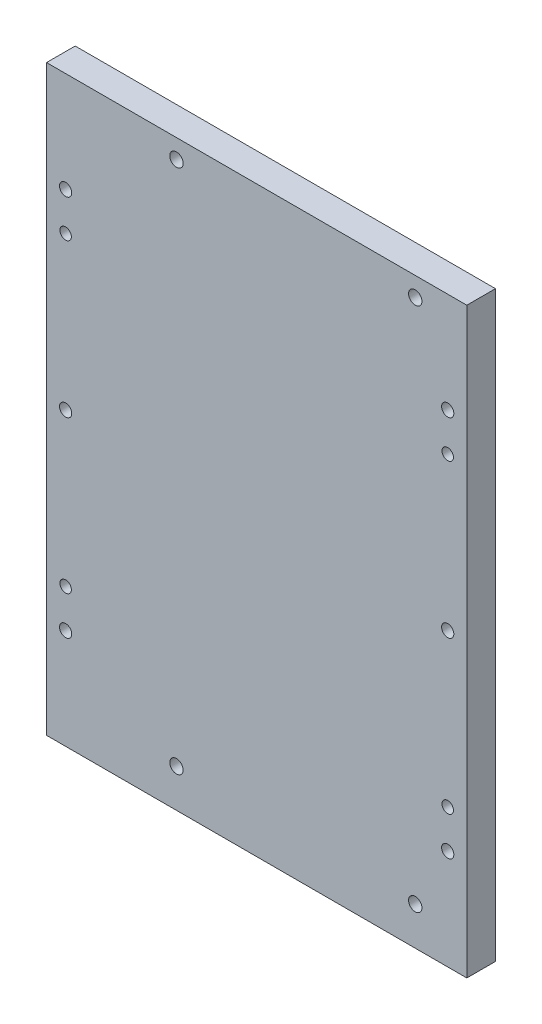
ISO-10303-21;
HEADER;
FILE_DESCRIPTION(('STEP AP214'),'2;1');
FILE_NAME('part.step','',(''),(''),'','','');
FILE_SCHEMA(('AUTOMOTIVE_DESIGN { 1 0 10303 214 1 1 1 1 }'));
ENDSEC;
DATA;
#1=APPLICATION_CONTEXT('core data for automotive mechanical design processes');
#2=APPLICATION_PROTOCOL_DEFINITION('international standard','automotive_design',2000,#1);
#3=PRODUCT_CONTEXT('',#1,'mechanical');
#4=PRODUCT('Part','Part','',(#3));
#5=PRODUCT_RELATED_PRODUCT_CATEGORY('part','',(#4));
#6=PRODUCT_DEFINITION_FORMATION('','',#4);
#7=PRODUCT_DEFINITION_CONTEXT('part definition',#1,'design');
#8=PRODUCT_DEFINITION('design','',#6,#7);
#9=PRODUCT_DEFINITION_SHAPE('','',#8);
#10=(LENGTH_UNIT() NAMED_UNIT(*) SI_UNIT(.MILLI.,.METRE.));
#11=(NAMED_UNIT(*) PLANE_ANGLE_UNIT() SI_UNIT($,.RADIAN.));
#12=(NAMED_UNIT(*) SI_UNIT($,.STERADIAN.) SOLID_ANGLE_UNIT());
#13=UNCERTAINTY_MEASURE_WITH_UNIT(LENGTH_MEASURE(1.E-05),#10,'distance_accuracy_value','');
#14=(GEOMETRIC_REPRESENTATION_CONTEXT(3) GLOBAL_UNCERTAINTY_ASSIGNED_CONTEXT((#13)) GLOBAL_UNIT_ASSIGNED_CONTEXT((#10,
#11,#12)) REPRESENTATION_CONTEXT('',''));
#15=CARTESIAN_POINT('',(0.,0.,0.));
#16=DIRECTION('',(0.,0.,1.));
#17=DIRECTION('',(1.,0.,0.));
#18=AXIS2_PLACEMENT_3D('',#15,#16,#17);
#19=CARTESIAN_POINT('',(100.,-100.,0.));
#20=DIRECTION('',(0.,0.,-1.));
#21=DIRECTION('',(-1.,0.,0.));
#22=AXIS2_PLACEMENT_3D('',#19,#20,#21);
#23=CYLINDRICAL_SURFACE('',#22,5.50000000000001);
#24=CARTESIAN_POINT('',(100.,-100.,0.));
#25=DIRECTION('',(0.,0.,-1.));
#26=DIRECTION('',(-1.,0.,0.));
#27=AXIS2_PLACEMENT_3D('',#24,#25,#26);
#28=CIRCLE('',#27,5.50000000000001);
#29=CARTESIAN_POINT('',(94.5,-100.,0.));
#30=VERTEX_POINT('',#29);
#31=EDGE_CURVE('E177',#30,#30,#28,.F.);
#32=ORIENTED_EDGE('',*,*,#31,.F.);
#33=EDGE_LOOP('',(#32));
#34=FACE_BOUND('',#33,.T.);
#35=CARTESIAN_POINT('',(100.,-100.,6.4));
#36=DIRECTION('',(0.,0.,-1.));
#37=DIRECTION('',(-1.,0.,0.));
#38=AXIS2_PLACEMENT_3D('',#35,#36,#37);
#39=CIRCLE('',#38,5.50000000000001);
#40=CARTESIAN_POINT('',(94.5,-100.,6.4));
#41=VERTEX_POINT('',#40);
#42=EDGE_CURVE('E19',#41,#41,#39,.F.);
#43=ORIENTED_EDGE('',*,*,#42,.T.);
#44=EDGE_LOOP('',(#43));
#45=FACE_BOUND('',#44,.T.);
#46=ADVANCED_FACE('F16',(#34,#45),#23,.F.);
#47=CARTESIAN_POINT('',(100.,0.,0.));
#48=DIRECTION('',(0.,0.,-1.));
#49=DIRECTION('',(-1.,0.,0.));
#50=AXIS2_PLACEMENT_3D('',#47,#48,#49);
#51=CYLINDRICAL_SURFACE('',#50,5.50000000000001);
#52=CARTESIAN_POINT('',(100.,0.,0.));
#53=DIRECTION('',(0.,0.,-1.));
#54=DIRECTION('',(-1.,0.,0.));
#55=AXIS2_PLACEMENT_3D('',#52,#53,#54);
#56=CIRCLE('',#55,5.50000000000001);
#57=CARTESIAN_POINT('',(94.5,0.,0.));
#58=VERTEX_POINT('',#57);
#59=EDGE_CURVE('E174',#58,#58,#56,.F.);
#60=ORIENTED_EDGE('',*,*,#59,.F.);
#61=EDGE_LOOP('',(#60));
#62=FACE_BOUND('',#61,.T.);
#63=CARTESIAN_POINT('',(100.,0.,6.4));
#64=DIRECTION('',(0.,0.,-1.));
#65=DIRECTION('',(-1.,0.,0.));
#66=AXIS2_PLACEMENT_3D('',#63,#64,#65);
#67=CIRCLE('',#66,5.50000000000001);
#68=CARTESIAN_POINT('',(94.5,0.,6.4));
#69=VERTEX_POINT('',#68);
#70=EDGE_CURVE('E191',#69,#69,#67,.F.);
#71=ORIENTED_EDGE('',*,*,#70,.T.);
#72=EDGE_LOOP('',(#71));
#73=FACE_BOUND('',#72,.T.);
#74=ADVANCED_FACE('F295',(#62,#73),#51,.F.);
#75=CARTESIAN_POINT('',(100.,100.,0.));
#76=DIRECTION('',(0.,0.,-1.));
#77=DIRECTION('',(-1.,0.,0.));
#78=AXIS2_PLACEMENT_3D('',#75,#76,#77);
#79=CYLINDRICAL_SURFACE('',#78,5.50000000000001);
#80=CARTESIAN_POINT('',(100.,100.,0.));
#81=DIRECTION('',(0.,0.,-1.));
#82=DIRECTION('',(-1.,0.,0.));
#83=AXIS2_PLACEMENT_3D('',#80,#81,#82);
#84=CIRCLE('',#83,5.50000000000001);
#85=CARTESIAN_POINT('',(94.5,100.,0.));
#86=VERTEX_POINT('',#85);
#87=EDGE_CURVE('E171',#86,#86,#84,.F.);
#88=ORIENTED_EDGE('',*,*,#87,.F.);
#89=EDGE_LOOP('',(#88));
#90=FACE_BOUND('',#89,.T.);
#91=CARTESIAN_POINT('',(100.,100.,6.4));
#92=DIRECTION('',(0.,0.,-1.));
#93=DIRECTION('',(-1.,0.,0.));
#94=AXIS2_PLACEMENT_3D('',#91,#92,#93);
#95=CIRCLE('',#94,5.50000000000001);
#96=CARTESIAN_POINT('',(94.5,100.,6.4));
#97=VERTEX_POINT('',#96);
#98=EDGE_CURVE('E189',#97,#97,#95,.F.);
#99=ORIENTED_EDGE('',*,*,#98,.T.);
#100=EDGE_LOOP('',(#99));
#101=FACE_BOUND('',#100,.T.);
#102=ADVANCED_FACE('F292',(#90,#101),#79,.F.);
#103=CARTESIAN_POINT('',(-100.,100.,0.));
#104=DIRECTION('',(0.,0.,-1.));
#105=DIRECTION('',(-1.,0.,0.));
#106=AXIS2_PLACEMENT_3D('',#103,#104,#105);
#107=CYLINDRICAL_SURFACE('',#106,5.50000000000001);
#108=CARTESIAN_POINT('',(-100.,100.,0.));
#109=DIRECTION('',(0.,0.,-1.));
#110=DIRECTION('',(-1.,0.,0.));
#111=AXIS2_PLACEMENT_3D('',#108,#109,#110);
#112=CIRCLE('',#111,5.50000000000001);
#113=CARTESIAN_POINT('',(-105.5,100.,0.));
#114=VERTEX_POINT('',#113);
#115=EDGE_CURVE('E168',#114,#114,#112,.F.);
#116=ORIENTED_EDGE('',*,*,#115,.F.);
#117=EDGE_LOOP('',(#116));
#118=FACE_BOUND('',#117,.T.);
#119=CARTESIAN_POINT('',(-100.,100.,6.4));
#120=DIRECTION('',(0.,0.,-1.));
#121=DIRECTION('',(-1.,0.,0.));
#122=AXIS2_PLACEMENT_3D('',#119,#120,#121);
#123=CIRCLE('',#122,5.50000000000001);
#124=CARTESIAN_POINT('',(-105.5,100.,6.4));
#125=VERTEX_POINT('',#124);
#126=EDGE_CURVE('E186',#125,#125,#123,.F.);
#127=ORIENTED_EDGE('',*,*,#126,.T.);
#128=EDGE_LOOP('',(#127));
#129=FACE_BOUND('',#128,.T.);
#130=ADVANCED_FACE('F288',(#118,#129),#107,.F.);
#131=CARTESIAN_POINT('',(-100.,0.,0.));
#132=DIRECTION('',(0.,0.,-1.));
#133=DIRECTION('',(-1.,0.,0.));
#134=AXIS2_PLACEMENT_3D('',#131,#132,#133);
#135=CYLINDRICAL_SURFACE('',#134,5.50000000000001);
#136=CARTESIAN_POINT('',(-100.,0.,0.));
#137=DIRECTION('',(0.,0.,-1.));
#138=DIRECTION('',(-1.,0.,0.));
#139=AXIS2_PLACEMENT_3D('',#136,#137,#138);
#140=CIRCLE('',#139,5.50000000000001);
#141=CARTESIAN_POINT('',(-105.5,0.,0.));
#142=VERTEX_POINT('',#141);
#143=EDGE_CURVE('E165',#142,#142,#140,.F.);
#144=ORIENTED_EDGE('',*,*,#143,.F.);
#145=EDGE_LOOP('',(#144));
#146=FACE_BOUND('',#145,.T.);
#147=CARTESIAN_POINT('',(-100.,0.,6.4));
#148=DIRECTION('',(0.,0.,-1.));
#149=DIRECTION('',(-1.,0.,0.));
#150=AXIS2_PLACEMENT_3D('',#147,#148,#149);
#151=CIRCLE('',#150,5.50000000000001);
#152=CARTESIAN_POINT('',(-105.5,0.,6.4));
#153=VERTEX_POINT('',#152);
#154=EDGE_CURVE('E183',#153,#153,#151,.F.);
#155=ORIENTED_EDGE('',*,*,#154,.T.);
#156=EDGE_LOOP('',(#155));
#157=FACE_BOUND('',#156,.T.);
#158=ADVANCED_FACE('F284',(#146,#157),#135,.F.);
#159=CARTESIAN_POINT('',(-100.,-100.,0.));
#160=DIRECTION('',(0.,0.,-1.));
#161=DIRECTION('',(-1.,0.,0.));
#162=AXIS2_PLACEMENT_3D('',#159,#160,#161);
#163=CYLINDRICAL_SURFACE('',#162,5.50000000000001);
#164=CARTESIAN_POINT('',(-100.,-100.,0.));
#165=DIRECTION('',(0.,0.,-1.));
#166=DIRECTION('',(-1.,0.,0.));
#167=AXIS2_PLACEMENT_3D('',#164,#165,#166);
#168=CIRCLE('',#167,5.50000000000001);
#169=CARTESIAN_POINT('',(-105.5,-100.,0.));
#170=VERTEX_POINT('',#169);
#171=EDGE_CURVE('E162',#170,#170,#168,.F.);
#172=ORIENTED_EDGE('',*,*,#171,.F.);
#173=EDGE_LOOP('',(#172));
#174=FACE_BOUND('',#173,.T.);
#175=CARTESIAN_POINT('',(-100.,-100.,6.4));
#176=DIRECTION('',(0.,0.,-1.));
#177=DIRECTION('',(-1.,0.,0.));
#178=AXIS2_PLACEMENT_3D('',#175,#176,#177);
#179=CIRCLE('',#178,5.50000000000001);
#180=CARTESIAN_POINT('',(-105.5,-100.,6.4));
#181=VERTEX_POINT('',#180);
#182=EDGE_CURVE('E180',#181,#181,#179,.F.);
#183=ORIENTED_EDGE('',*,*,#182,.T.);
#184=EDGE_LOOP('',(#183));
#185=FACE_BOUND('',#184,.T.);
#186=ADVANCED_FACE('F203',(#174,#185),#163,.F.);
#187=CARTESIAN_POINT('',(103.2,-100.,6.4));
#188=DIRECTION('',(0.,0.,1.));
#189=DIRECTION('',(1.,0.,0.));
#190=AXIS2_PLACEMENT_3D('',#187,#188,#189);
#191=PLANE('',#190);
#192=ORIENTED_EDGE('',*,*,#42,.F.);
#193=EDGE_LOOP('',(#192));
#194=FACE_BOUND('',#193,.T.);
#195=CARTESIAN_POINT('',(100.,-100.,6.4));
#196=DIRECTION('',(0.,0.,-1.));
#197=DIRECTION('',(-1.,0.,0.));
#198=AXIS2_PLACEMENT_3D('',#195,#196,#197);
#199=CIRCLE('',#198,3.19999999999999);
#200=CARTESIAN_POINT('',(96.8,-100.,6.4));
#201=VERTEX_POINT('',#200);
#202=EDGE_CURVE('E145',#201,#201,#199,.F.);
#203=ORIENTED_EDGE('',*,*,#202,.T.);
#204=EDGE_LOOP('',(#203));
#205=FACE_BOUND('',#204,.T.);
#206=ADVANCED_FACE('F199',(#194,#205),#191,.F.);
#207=CARTESIAN_POINT('',(103.2,0.,6.4));
#208=DIRECTION('',(0.,0.,1.));
#209=DIRECTION('',(1.,0.,0.));
#210=AXIS2_PLACEMENT_3D('',#207,#208,#209);
#211=PLANE('',#210);
#212=ORIENTED_EDGE('',*,*,#70,.F.);
#213=EDGE_LOOP('',(#212));
#214=FACE_BOUND('',#213,.T.);
#215=CARTESIAN_POINT('',(100.,0.,6.4));
#216=DIRECTION('',(0.,0.,-1.));
#217=DIRECTION('',(-1.,0.,0.));
#218=AXIS2_PLACEMENT_3D('',#215,#216,#217);
#219=CIRCLE('',#218,3.19999999999999);
#220=CARTESIAN_POINT('',(96.8,0.,6.4));
#221=VERTEX_POINT('',#220);
#222=EDGE_CURVE('E142',#221,#221,#219,.F.);
#223=ORIENTED_EDGE('',*,*,#222,.T.);
#224=EDGE_LOOP('',(#223));
#225=FACE_BOUND('',#224,.T.);
#226=ADVANCED_FACE('F202',(#214,#225),#211,.F.);
#227=CARTESIAN_POINT('',(103.2,100.,6.4));
#228=DIRECTION('',(0.,0.,1.));
#229=DIRECTION('',(1.,0.,0.));
#230=AXIS2_PLACEMENT_3D('',#227,#228,#229);
#231=PLANE('',#230);
#232=ORIENTED_EDGE('',*,*,#98,.F.);
#233=EDGE_LOOP('',(#232));
#234=FACE_BOUND('',#233,.T.);
#235=CARTESIAN_POINT('',(100.,100.,6.4));
#236=DIRECTION('',(0.,0.,-1.));
#237=DIRECTION('',(-1.,0.,0.));
#238=AXIS2_PLACEMENT_3D('',#235,#236,#237);
#239=CIRCLE('',#238,3.19999999999999);
#240=CARTESIAN_POINT('',(96.8,100.,6.4));
#241=VERTEX_POINT('',#240);
#242=EDGE_CURVE('E139',#241,#241,#239,.F.);
#243=ORIENTED_EDGE('',*,*,#242,.T.);
#244=EDGE_LOOP('',(#243));
#245=FACE_BOUND('',#244,.T.);
#246=ADVANCED_FACE('F265',(#234,#245),#231,.F.);
#247=CARTESIAN_POINT('',(-96.8,100.,6.4));
#248=DIRECTION('',(0.,0.,1.));
#249=DIRECTION('',(1.,0.,0.));
#250=AXIS2_PLACEMENT_3D('',#247,#248,#249);
#251=PLANE('',#250);
#252=ORIENTED_EDGE('',*,*,#126,.F.);
#253=EDGE_LOOP('',(#252));
#254=FACE_BOUND('',#253,.T.);
#255=CARTESIAN_POINT('',(-100.,100.,6.4));
#256=DIRECTION('',(0.,0.,-1.));
#257=DIRECTION('',(-1.,0.,0.));
#258=AXIS2_PLACEMENT_3D('',#255,#256,#257);
#259=CIRCLE('',#258,3.19999999999999);
#260=CARTESIAN_POINT('',(-103.2,100.,6.4));
#261=VERTEX_POINT('',#260);
#262=EDGE_CURVE('E136',#261,#261,#259,.F.);
#263=ORIENTED_EDGE('',*,*,#262,.T.);
#264=EDGE_LOOP('',(#263));
#265=FACE_BOUND('',#264,.T.);
#266=ADVANCED_FACE('F267',(#254,#265),#251,.F.);
#267=CARTESIAN_POINT('',(-96.8,0.,6.4));
#268=DIRECTION('',(0.,0.,1.));
#269=DIRECTION('',(1.,0.,0.));
#270=AXIS2_PLACEMENT_3D('',#267,#268,#269);
#271=PLANE('',#270);
#272=ORIENTED_EDGE('',*,*,#154,.F.);
#273=EDGE_LOOP('',(#272));
#274=FACE_BOUND('',#273,.T.);
#275=CARTESIAN_POINT('',(-100.,0.,6.4));
#276=DIRECTION('',(0.,0.,-1.));
#277=DIRECTION('',(-1.,0.,0.));
#278=AXIS2_PLACEMENT_3D('',#275,#276,#277);
#279=CIRCLE('',#278,3.19999999999999);
#280=CARTESIAN_POINT('',(-103.2,0.,6.4));
#281=VERTEX_POINT('',#280);
#282=EDGE_CURVE('E133',#281,#281,#279,.F.);
#283=ORIENTED_EDGE('',*,*,#282,.T.);
#284=EDGE_LOOP('',(#283));
#285=FACE_BOUND('',#284,.T.);
#286=ADVANCED_FACE('F274',(#274,#285),#271,.F.);
#287=CARTESIAN_POINT('',(-96.8,-100.,6.4));
#288=DIRECTION('',(0.,0.,1.));
#289=DIRECTION('',(1.,0.,0.));
#290=AXIS2_PLACEMENT_3D('',#287,#288,#289);
#291=PLANE('',#290);
#292=ORIENTED_EDGE('',*,*,#182,.F.);
#293=EDGE_LOOP('',(#292));
#294=FACE_BOUND('',#293,.T.);
#295=CARTESIAN_POINT('',(-100.,-100.,6.4));
#296=DIRECTION('',(0.,0.,-1.));
#297=DIRECTION('',(-1.,0.,0.));
#298=AXIS2_PLACEMENT_3D('',#295,#296,#297);
#299=CIRCLE('',#298,3.19999999999999);
#300=CARTESIAN_POINT('',(-103.2,-100.,6.4));
#301=VERTEX_POINT('',#300);
#302=EDGE_CURVE('E130',#301,#301,#299,.F.);
#303=ORIENTED_EDGE('',*,*,#302,.T.);
#304=EDGE_LOOP('',(#303));
#305=FACE_BOUND('',#304,.T.);
#306=ADVANCED_FACE('F308',(#294,#305),#291,.F.);
#307=CARTESIAN_POINT('',(-110.,-152.5,0.));
#308=DIRECTION('',(0.,0.,-1.));
#309=DIRECTION('',(-1.,0.,0.));
#310=AXIS2_PLACEMENT_3D('',#307,#308,#309);
#311=PLANE('',#310);
#312=CARTESIAN_POINT('',(83.0000000000001,142.5,0.));
#313=DIRECTION('',(0.,0.,1.));
#314=DIRECTION('',(1.,0.,0.));
#315=AXIS2_PLACEMENT_3D('',#312,#313,#314);
#316=CIRCLE('',#315,3.5);
#317=CARTESIAN_POINT('',(86.5000000000001,142.5,0.));
#318=VERTEX_POINT('',#317);
#319=EDGE_CURVE('E124',#318,#318,#316,.T.);
#320=ORIENTED_EDGE('',*,*,#319,.T.);
#321=EDGE_LOOP('',(#320));
#322=FACE_BOUND('',#321,.T.);
#323=CARTESIAN_POINT('',(-42.0000000000002,-132.5,0.));
#324=DIRECTION('',(0.,0.,1.));
#325=DIRECTION('',(1.,0.,0.));
#326=AXIS2_PLACEMENT_3D('',#323,#324,#325);
#327=CIRCLE('',#326,3.5);
#328=CARTESIAN_POINT('',(-38.5000000000002,-132.5,0.));
#329=VERTEX_POINT('',#328);
#330=EDGE_CURVE('E127',#329,#329,#327,.T.);
#331=ORIENTED_EDGE('',*,*,#330,.T.);
#332=EDGE_LOOP('',(#331));
#333=FACE_BOUND('',#332,.T.);
#334=ORIENTED_EDGE('',*,*,#171,.T.);
#335=EDGE_LOOP('',(#334));
#336=FACE_BOUND('',#335,.T.);
#337=ORIENTED_EDGE('',*,*,#143,.T.);
#338=EDGE_LOOP('',(#337));
#339=FACE_BOUND('',#338,.T.);
#340=ORIENTED_EDGE('',*,*,#115,.T.);
#341=EDGE_LOOP('',(#340));
#342=FACE_BOUND('',#341,.T.);
#343=ORIENTED_EDGE('',*,*,#87,.T.);
#344=EDGE_LOOP('',(#343));
#345=FACE_BOUND('',#344,.T.);
#346=ORIENTED_EDGE('',*,*,#59,.T.);
#347=EDGE_LOOP('',(#346));
#348=FACE_BOUND('',#347,.T.);
#349=ORIENTED_EDGE('',*,*,#31,.T.);
#350=EDGE_LOOP('',(#349));
#351=FACE_BOUND('',#350,.T.);
#352=CARTESIAN_POINT('',(-100.,-80.,0.));
#353=DIRECTION('',(0.,0.,1.));
#354=DIRECTION('',(1.,0.,0.));
#355=AXIS2_PLACEMENT_3D('',#352,#353,#354);
#356=CIRCLE('',#355,2.99499999999998);
#357=CARTESIAN_POINT('',(-97.005,-80.,0.));
#358=VERTEX_POINT('',#357);
#359=EDGE_CURVE('E148',#358,#358,#356,.T.);
#360=ORIENTED_EDGE('',*,*,#359,.T.);
#361=EDGE_LOOP('',(#360));
#362=FACE_BOUND('',#361,.T.);
#363=CARTESIAN_POINT('',(-100.,80.,0.));
#364=DIRECTION('',(0.,0.,1.));
#365=DIRECTION('',(1.,0.,0.));
#366=AXIS2_PLACEMENT_3D('',#363,#364,#365);
#367=CIRCLE('',#366,2.995);
#368=CARTESIAN_POINT('',(-97.005,80.,0.));
#369=VERTEX_POINT('',#368);
#370=EDGE_CURVE('E151',#369,#369,#367,.T.);
#371=ORIENTED_EDGE('',*,*,#370,.T.);
#372=EDGE_LOOP('',(#371));
#373=FACE_BOUND('',#372,.T.);
#374=CARTESIAN_POINT('',(100.,80.,0.));
#375=DIRECTION('',(0.,0.,1.));
#376=DIRECTION('',(1.,0.,0.));
#377=AXIS2_PLACEMENT_3D('',#374,#375,#376);
#378=CIRCLE('',#377,2.995);
#379=CARTESIAN_POINT('',(102.995,80.,0.));
#380=VERTEX_POINT('',#379);
#381=EDGE_CURVE('E154',#380,#380,#378,.T.);
#382=ORIENTED_EDGE('',*,*,#381,.T.);
#383=EDGE_LOOP('',(#382));
#384=FACE_BOUND('',#383,.T.);
#385=CARTESIAN_POINT('',(100.,-80.,0.));
#386=DIRECTION('',(0.,0.,1.));
#387=DIRECTION('',(1.,0.,0.));
#388=AXIS2_PLACEMENT_3D('',#385,#386,#387);
#389=CIRCLE('',#388,2.99499999999998);
#390=CARTESIAN_POINT('',(102.995,-80.,0.));
#391=VERTEX_POINT('',#390);
#392=EDGE_CURVE('E157',#391,#391,#389,.T.);
#393=ORIENTED_EDGE('',*,*,#392,.T.);
#394=EDGE_LOOP('',(#393));
#395=FACE_BOUND('',#394,.T.);
#396=DIRECTION('',(1.,0.,0.));
#397=VECTOR('',#396,1.);
#398=CARTESIAN_POINT('',(-110.,152.5,0.));
#399=LINE('',#398,#397);
#400=CARTESIAN_POINT('',(-110.,152.5,0.));
#401=VERTEX_POINT('',#400);
#402=CARTESIAN_POINT('',(110.,152.5,0.));
#403=VERTEX_POINT('',#402);
#404=EDGE_CURVE('E55',#401,#403,#399,.T.);
#405=ORIENTED_EDGE('',*,*,#404,.T.);
#406=DIRECTION('',(0.,1.,0.));
#407=VECTOR('',#406,1.);
#408=CARTESIAN_POINT('',(110.,152.5,0.));
#409=LINE('',#408,#407);
#410=CARTESIAN_POINT('',(110.,-152.5,0.));
#411=VERTEX_POINT('',#410);
#412=EDGE_CURVE('E503',#403,#411,#409,.F.);
#413=ORIENTED_EDGE('',*,*,#412,.T.);
#414=DIRECTION('',(-1.,0.,0.));
#415=VECTOR('',#414,1.);
#416=CARTESIAN_POINT('',(110.,-152.5,0.));
#417=LINE('',#416,#415);
#418=CARTESIAN_POINT('',(-110.,-152.5,0.));
#419=VERTEX_POINT('',#418);
#420=EDGE_CURVE('E61',#411,#419,#417,.T.);
#421=ORIENTED_EDGE('',*,*,#420,.T.);
#422=DIRECTION('',(0.,1.,0.));
#423=VECTOR('',#422,1.);
#424=CARTESIAN_POINT('',(-110.,-152.5,0.));
#425=LINE('',#424,#423);
#426=EDGE_CURVE('E58',#419,#401,#425,.T.);
#427=ORIENTED_EDGE('',*,*,#426,.T.);
#428=EDGE_LOOP('',(#405,#413,#421,#427));
#429=FACE_BOUND('',#428,.T.);
#430=CARTESIAN_POINT('',(83.0000000000001,-132.5,0.));
#431=DIRECTION('',(0.,0.,1.));
#432=DIRECTION('',(1.,0.,0.));
#433=AXIS2_PLACEMENT_3D('',#430,#431,#432);
#434=CIRCLE('',#433,3.5);
#435=CARTESIAN_POINT('',(86.5000000000001,-132.5,0.));
#436=VERTEX_POINT('',#435);
#437=EDGE_CURVE('E121',#436,#436,#434,.T.);
#438=ORIENTED_EDGE('',*,*,#437,.T.);
#439=EDGE_LOOP('',(#438));
#440=FACE_BOUND('',#439,.T.);
#441=CARTESIAN_POINT('',(-42.0000000000002,142.5,0.));
#442=DIRECTION('',(0.,0.,1.));
#443=DIRECTION('',(1.,0.,0.));
#444=AXIS2_PLACEMENT_3D('',#441,#442,#443);
#445=CIRCLE('',#444,3.5);
#446=CARTESIAN_POINT('',(-38.5000000000002,142.5,0.));
#447=VERTEX_POINT('',#446);
#448=EDGE_CURVE('E67',#447,#447,#445,.T.);
#449=ORIENTED_EDGE('',*,*,#448,.T.);
#450=EDGE_LOOP('',(#449));
#451=FACE_BOUND('',#450,.T.);
#452=ADVANCED_FACE('F59',(#322,#333,#336,#339,#342,#345,#348,#351,#362,#373,#384,#395,#429,#440,
#451),#311,.T.);
#453=CARTESIAN_POINT('',(-42.0000000000002,142.5,15.));
#454=DIRECTION('',(0.,0.,1.));
#455=DIRECTION('',(1.,0.,0.));
#456=AXIS2_PLACEMENT_3D('',#453,#454,#455);
#457=CYLINDRICAL_SURFACE('',#456,3.5);
#458=ORIENTED_EDGE('',*,*,#448,.F.);
#459=EDGE_LOOP('',(#458));
#460=FACE_BOUND('',#459,.T.);
#461=CARTESIAN_POINT('',(-42.0000000000002,142.5,15.));
#462=DIRECTION('',(0.,0.,1.));
#463=DIRECTION('',(1.,0.,0.));
#464=AXIS2_PLACEMENT_3D('',#461,#462,#463);
#465=CIRCLE('',#464,3.5);
#466=CARTESIAN_POINT('',(-38.5000000000002,142.5,15.));
#467=VERTEX_POINT('',#466);
#468=EDGE_CURVE('E118',#467,#467,#465,.T.);
#469=ORIENTED_EDGE('',*,*,#468,.T.);
#470=EDGE_LOOP('',(#469));
#471=FACE_BOUND('',#470,.T.);
#472=ADVANCED_FACE('F307',(#460,#471),#457,.F.);
#473=CARTESIAN_POINT('',(-110.,-152.5,15.));
#474=DIRECTION('',(1.,0.,0.));
#475=DIRECTION('',(0.,0.,-1.));
#476=AXIS2_PLACEMENT_3D('',#473,#474,#475);
#477=PLANE('',#476);
#478=DIRECTION('',(0.,0.,1.));
#479=VECTOR('',#478,1.);
#480=CARTESIAN_POINT('',(-110.,-152.5,15.));
#481=LINE('',#480,#479);
#482=CARTESIAN_POINT('',(-110.,-152.5,15.));
#483=VERTEX_POINT('',#482);
#484=EDGE_CURVE('E504',#419,#483,#481,.T.);
#485=ORIENTED_EDGE('',*,*,#484,.T.);
#486=DIRECTION('',(0.,1.,0.));
#487=VECTOR('',#486,1.);
#488=CARTESIAN_POINT('',(-110.,-152.5,15.));
#489=LINE('',#488,#487);
#490=CARTESIAN_POINT('',(-110.,152.5,15.));
#491=VERTEX_POINT('',#490);
#492=EDGE_CURVE('E78',#483,#491,#489,.T.);
#493=ORIENTED_EDGE('',*,*,#492,.T.);
#494=DIRECTION('',(0.,0.,1.));
#495=VECTOR('',#494,1.);
#496=CARTESIAN_POINT('',(-110.,152.5,15.));
#497=LINE('',#496,#495);
#498=EDGE_CURVE('E66',#491,#401,#497,.F.);
#499=ORIENTED_EDGE('',*,*,#498,.T.);
#500=ORIENTED_EDGE('',*,*,#426,.F.);
#501=EDGE_LOOP('',(#485,#493,#499,#500));
#502=FACE_BOUND('',#501,.T.);
#503=ADVANCED_FACE('F77',(#502),#477,.F.);
#504=CARTESIAN_POINT('',(-110.,152.5,15.));
#505=DIRECTION('',(0.,-1.,0.));
#506=DIRECTION('',(1.,0.,0.));
#507=AXIS2_PLACEMENT_3D('',#504,#505,#506);
#508=PLANE('',#507);
#509=ORIENTED_EDGE('',*,*,#498,.F.);
#510=DIRECTION('',(-1.,0.,0.));
#511=VECTOR('',#510,1.);
#512=CARTESIAN_POINT('',(-110.,152.5,15.));
#513=LINE('',#512,#511);
#514=CARTESIAN_POINT('',(110.,152.5,15.));
#515=VERTEX_POINT('',#514);
#516=EDGE_CURVE('E511',#491,#515,#513,.F.);
#517=ORIENTED_EDGE('',*,*,#516,.T.);
#518=DIRECTION('',(0.,0.,1.));
#519=VECTOR('',#518,1.);
#520=CARTESIAN_POINT('',(110.,152.5,15.));
#521=LINE('',#520,#519);
#522=EDGE_CURVE('E74',#515,#403,#521,.F.);
#523=ORIENTED_EDGE('',*,*,#522,.T.);
#524=ORIENTED_EDGE('',*,*,#404,.F.);
#525=EDGE_LOOP('',(#509,#517,#523,#524));
#526=FACE_BOUND('',#525,.T.);
#527=ADVANCED_FACE('F71',(#526),#508,.F.);
#528=CARTESIAN_POINT('',(110.,152.5,15.));
#529=DIRECTION('',(-1.,0.,0.));
#530=DIRECTION('',(0.,0.,1.));
#531=AXIS2_PLACEMENT_3D('',#528,#529,#530);
#532=PLANE('',#531);
#533=ORIENTED_EDGE('',*,*,#522,.F.);
#534=DIRECTION('',(0.,1.,0.));
#535=VECTOR('',#534,1.);
#536=CARTESIAN_POINT('',(110.,-152.5,15.));
#537=LINE('',#536,#535);
#538=CARTESIAN_POINT('',(110.,-152.5,15.));
#539=VERTEX_POINT('',#538);
#540=EDGE_CURVE('E333',#515,#539,#537,.F.);
#541=ORIENTED_EDGE('',*,*,#540,.T.);
#542=DIRECTION('',(0.,0.,1.));
#543=VECTOR('',#542,1.);
#544=CARTESIAN_POINT('',(110.,-152.5,15.));
#545=LINE('',#544,#543);
#546=EDGE_CURVE('E34',#539,#411,#545,.F.);
#547=ORIENTED_EDGE('',*,*,#546,.T.);
#548=ORIENTED_EDGE('',*,*,#412,.F.);
#549=EDGE_LOOP('',(#533,#541,#547,#548));
#550=FACE_BOUND('',#549,.T.);
#551=ADVANCED_FACE('F391',(#550),#532,.F.);
#552=CARTESIAN_POINT('',(110.,-152.5,15.));
#553=DIRECTION('',(0.,1.,0.));
#554=DIRECTION('',(-1.,0.,0.));
#555=AXIS2_PLACEMENT_3D('',#552,#553,#554);
#556=PLANE('',#555);
#557=ORIENTED_EDGE('',*,*,#546,.F.);
#558=DIRECTION('',(-1.,0.,0.));
#559=VECTOR('',#558,1.);
#560=CARTESIAN_POINT('',(-110.,-152.5,15.));
#561=LINE('',#560,#559);
#562=EDGE_CURVE('E117',#539,#483,#561,.T.);
#563=ORIENTED_EDGE('',*,*,#562,.T.);
#564=ORIENTED_EDGE('',*,*,#484,.F.);
#565=ORIENTED_EDGE('',*,*,#420,.F.);
#566=EDGE_LOOP('',(#557,#563,#564,#565));
#567=FACE_BOUND('',#566,.T.);
#568=ADVANCED_FACE('F325',(#567),#556,.F.);
#569=CARTESIAN_POINT('',(100.,-80.,15.));
#570=DIRECTION('',(0.,0.,1.));
#571=DIRECTION('',(1.,0.,0.));
#572=AXIS2_PLACEMENT_3D('',#569,#570,#571);
#573=CYLINDRICAL_SURFACE('',#572,2.99499999999998);
#574=ORIENTED_EDGE('',*,*,#392,.F.);
#575=EDGE_LOOP('',(#574));
#576=FACE_BOUND('',#575,.T.);
#577=CARTESIAN_POINT('',(100.,-80.,15.));
#578=DIRECTION('',(0.,0.,1.));
#579=DIRECTION('',(1.,0.,0.));
#580=AXIS2_PLACEMENT_3D('',#577,#578,#579);
#581=CIRCLE('',#580,2.99499999999998);
#582=CARTESIAN_POINT('',(102.995,-80.,15.));
#583=VERTEX_POINT('',#582);
#584=EDGE_CURVE('E114',#583,#583,#581,.T.);
#585=ORIENTED_EDGE('',*,*,#584,.T.);
#586=EDGE_LOOP('',(#585));
#587=FACE_BOUND('',#586,.T.);
#588=ADVANCED_FACE('F321',(#576,#587),#573,.F.);
#589=CARTESIAN_POINT('',(100.,80.,15.));
#590=DIRECTION('',(0.,0.,1.));
#591=DIRECTION('',(1.,0.,0.));
#592=AXIS2_PLACEMENT_3D('',#589,#590,#591);
#593=CYLINDRICAL_SURFACE('',#592,2.995);
#594=ORIENTED_EDGE('',*,*,#381,.F.);
#595=EDGE_LOOP('',(#594));
#596=FACE_BOUND('',#595,.T.);
#597=CARTESIAN_POINT('',(100.,80.,15.));
#598=DIRECTION('',(0.,0.,1.));
#599=DIRECTION('',(1.,0.,0.));
#600=AXIS2_PLACEMENT_3D('',#597,#598,#599);
#601=CIRCLE('',#600,2.995);
#602=CARTESIAN_POINT('',(102.995,80.,15.));
#603=VERTEX_POINT('',#602);
#604=EDGE_CURVE('E111',#603,#603,#601,.T.);
#605=ORIENTED_EDGE('',*,*,#604,.T.);
#606=EDGE_LOOP('',(#605));
#607=FACE_BOUND('',#606,.T.);
#608=ADVANCED_FACE('F324',(#596,#607),#593,.F.);
#609=CARTESIAN_POINT('',(-100.,80.,15.));
#610=DIRECTION('',(0.,0.,1.));
#611=DIRECTION('',(1.,0.,0.));
#612=AXIS2_PLACEMENT_3D('',#609,#610,#611);
#613=CYLINDRICAL_SURFACE('',#612,2.995);
#614=ORIENTED_EDGE('',*,*,#370,.F.);
#615=EDGE_LOOP('',(#614));
#616=FACE_BOUND('',#615,.T.);
#617=CARTESIAN_POINT('',(-100.,80.,15.));
#618=DIRECTION('',(0.,0.,1.));
#619=DIRECTION('',(1.,0.,0.));
#620=AXIS2_PLACEMENT_3D('',#617,#618,#619);
#621=CIRCLE('',#620,2.995);
#622=CARTESIAN_POINT('',(-97.005,80.,15.));
#623=VERTEX_POINT('',#622);
#624=EDGE_CURVE('E108',#623,#623,#621,.T.);
#625=ORIENTED_EDGE('',*,*,#624,.T.);
#626=EDGE_LOOP('',(#625));
#627=FACE_BOUND('',#626,.T.);
#628=ADVANCED_FACE('F221',(#616,#627),#613,.F.);
#629=CARTESIAN_POINT('',(-100.,-80.,15.));
#630=DIRECTION('',(0.,0.,1.));
#631=DIRECTION('',(1.,0.,0.));
#632=AXIS2_PLACEMENT_3D('',#629,#630,#631);
#633=CYLINDRICAL_SURFACE('',#632,2.99499999999998);
#634=ORIENTED_EDGE('',*,*,#359,.F.);
#635=EDGE_LOOP('',(#634));
#636=FACE_BOUND('',#635,.T.);
#637=CARTESIAN_POINT('',(-100.,-80.,15.));
#638=DIRECTION('',(0.,0.,1.));
#639=DIRECTION('',(1.,0.,0.));
#640=AXIS2_PLACEMENT_3D('',#637,#638,#639);
#641=CIRCLE('',#640,2.99499999999998);
#642=CARTESIAN_POINT('',(-97.005,-80.,15.));
#643=VERTEX_POINT('',#642);
#644=EDGE_CURVE('E105',#643,#643,#641,.T.);
#645=ORIENTED_EDGE('',*,*,#644,.T.);
#646=EDGE_LOOP('',(#645));
#647=FACE_BOUND('',#646,.T.);
#648=ADVANCED_FACE('F210',(#636,#647),#633,.F.);
#649=CARTESIAN_POINT('',(100.,-100.,0.));
#650=DIRECTION('',(0.,0.,-1.));
#651=DIRECTION('',(-1.,0.,0.));
#652=AXIS2_PLACEMENT_3D('',#649,#650,#651);
#653=CYLINDRICAL_SURFACE('',#652,3.19999999999999);
#654=CARTESIAN_POINT('',(100.,-100.,15.));
#655=DIRECTION('',(0.,0.,-1.));
#656=DIRECTION('',(-1.,0.,0.));
#657=AXIS2_PLACEMENT_3D('',#654,#655,#656);
#658=CIRCLE('',#657,3.19999999999999);
#659=CARTESIAN_POINT('',(96.8,-100.,15.));
#660=VERTEX_POINT('',#659);
#661=EDGE_CURVE('E102',#660,#660,#658,.F.);
#662=ORIENTED_EDGE('',*,*,#661,.T.);
#663=EDGE_LOOP('',(#662));
#664=FACE_BOUND('',#663,.T.);
#665=ORIENTED_EDGE('',*,*,#202,.F.);
#666=EDGE_LOOP('',(#665));
#667=FACE_BOUND('',#666,.T.);
#668=ADVANCED_FACE('F207',(#664,#667),#653,.F.);
#669=CARTESIAN_POINT('',(100.,0.,0.));
#670=DIRECTION('',(0.,0.,-1.));
#671=DIRECTION('',(-1.,0.,0.));
#672=AXIS2_PLACEMENT_3D('',#669,#670,#671);
#673=CYLINDRICAL_SURFACE('',#672,3.19999999999999);
#674=CARTESIAN_POINT('',(100.,0.,15.));
#675=DIRECTION('',(0.,0.,-1.));
#676=DIRECTION('',(-1.,0.,0.));
#677=AXIS2_PLACEMENT_3D('',#674,#675,#676);
#678=CIRCLE('',#677,3.19999999999999);
#679=CARTESIAN_POINT('',(96.8,0.,15.));
#680=VERTEX_POINT('',#679);
#681=EDGE_CURVE('E99',#680,#680,#678,.F.);
#682=ORIENTED_EDGE('',*,*,#681,.T.);
#683=EDGE_LOOP('',(#682));
#684=FACE_BOUND('',#683,.T.);
#685=ORIENTED_EDGE('',*,*,#222,.F.);
#686=EDGE_LOOP('',(#685));
#687=FACE_BOUND('',#686,.T.);
#688=ADVANCED_FACE('F209',(#684,#687),#673,.F.);
#689=CARTESIAN_POINT('',(100.,100.,0.));
#690=DIRECTION('',(0.,0.,-1.));
#691=DIRECTION('',(-1.,0.,0.));
#692=AXIS2_PLACEMENT_3D('',#689,#690,#691);
#693=CYLINDRICAL_SURFACE('',#692,3.19999999999999);
#694=CARTESIAN_POINT('',(100.,100.,15.));
#695=DIRECTION('',(0.,0.,-1.));
#696=DIRECTION('',(-1.,0.,0.));
#697=AXIS2_PLACEMENT_3D('',#694,#695,#696);
#698=CIRCLE('',#697,3.19999999999999);
#699=CARTESIAN_POINT('',(96.8,100.,15.));
#700=VERTEX_POINT('',#699);
#701=EDGE_CURVE('E96',#700,#700,#698,.F.);
#702=ORIENTED_EDGE('',*,*,#701,.T.);
#703=EDGE_LOOP('',(#702));
#704=FACE_BOUND('',#703,.T.);
#705=ORIENTED_EDGE('',*,*,#242,.F.);
#706=EDGE_LOOP('',(#705));
#707=FACE_BOUND('',#706,.T.);
#708=ADVANCED_FACE('F218',(#704,#707),#693,.F.);
#709=CARTESIAN_POINT('',(-100.,100.,0.));
#710=DIRECTION('',(0.,0.,-1.));
#711=DIRECTION('',(-1.,0.,0.));
#712=AXIS2_PLACEMENT_3D('',#709,#710,#711);
#713=CYLINDRICAL_SURFACE('',#712,3.19999999999999);
#714=CARTESIAN_POINT('',(-100.,100.,15.));
#715=DIRECTION('',(0.,0.,-1.));
#716=DIRECTION('',(-1.,0.,0.));
#717=AXIS2_PLACEMENT_3D('',#714,#715,#716);
#718=CIRCLE('',#717,3.19999999999999);
#719=CARTESIAN_POINT('',(-103.2,100.,15.));
#720=VERTEX_POINT('',#719);
#721=EDGE_CURVE('E93',#720,#720,#718,.F.);
#722=ORIENTED_EDGE('',*,*,#721,.T.);
#723=EDGE_LOOP('',(#722));
#724=FACE_BOUND('',#723,.T.);
#725=ORIENTED_EDGE('',*,*,#262,.F.);
#726=EDGE_LOOP('',(#725));
#727=FACE_BOUND('',#726,.T.);
#728=ADVANCED_FACE('F252',(#724,#727),#713,.F.);
#729=CARTESIAN_POINT('',(-100.,0.,0.));
#730=DIRECTION('',(0.,0.,-1.));
#731=DIRECTION('',(-1.,0.,0.));
#732=AXIS2_PLACEMENT_3D('',#729,#730,#731);
#733=CYLINDRICAL_SURFACE('',#732,3.19999999999999);
#734=CARTESIAN_POINT('',(-100.,0.,15.));
#735=DIRECTION('',(0.,0.,-1.));
#736=DIRECTION('',(-1.,0.,0.));
#737=AXIS2_PLACEMENT_3D('',#734,#735,#736);
#738=CIRCLE('',#737,3.19999999999999);
#739=CARTESIAN_POINT('',(-103.2,0.,15.));
#740=VERTEX_POINT('',#739);
#741=EDGE_CURVE('E90',#740,#740,#738,.F.);
#742=ORIENTED_EDGE('',*,*,#741,.T.);
#743=EDGE_LOOP('',(#742));
#744=FACE_BOUND('',#743,.T.);
#745=ORIENTED_EDGE('',*,*,#282,.F.);
#746=EDGE_LOOP('',(#745));
#747=FACE_BOUND('',#746,.T.);
#748=ADVANCED_FACE('F248',(#744,#747),#733,.F.);
#749=CARTESIAN_POINT('',(-100.,-100.,0.));
#750=DIRECTION('',(0.,0.,-1.));
#751=DIRECTION('',(-1.,0.,0.));
#752=AXIS2_PLACEMENT_3D('',#749,#750,#751);
#753=CYLINDRICAL_SURFACE('',#752,3.19999999999999);
#754=CARTESIAN_POINT('',(-100.,-100.,15.));
#755=DIRECTION('',(0.,0.,-1.));
#756=DIRECTION('',(-1.,0.,0.));
#757=AXIS2_PLACEMENT_3D('',#754,#755,#756);
#758=CIRCLE('',#757,3.19999999999999);
#759=CARTESIAN_POINT('',(-103.2,-100.,15.));
#760=VERTEX_POINT('',#759);
#761=EDGE_CURVE('E87',#760,#760,#758,.F.);
#762=ORIENTED_EDGE('',*,*,#761,.T.);
#763=EDGE_LOOP('',(#762));
#764=FACE_BOUND('',#763,.T.);
#765=ORIENTED_EDGE('',*,*,#302,.F.);
#766=EDGE_LOOP('',(#765));
#767=FACE_BOUND('',#766,.T.);
#768=ADVANCED_FACE('F244',(#764,#767),#753,.F.);
#769=CARTESIAN_POINT('',(-42.0000000000002,-132.5,15.));
#770=DIRECTION('',(0.,0.,1.));
#771=DIRECTION('',(1.,0.,0.));
#772=AXIS2_PLACEMENT_3D('',#769,#770,#771);
#773=CYLINDRICAL_SURFACE('',#772,3.5);
#774=ORIENTED_EDGE('',*,*,#330,.F.);
#775=EDGE_LOOP('',(#774));
#776=FACE_BOUND('',#775,.T.);
#777=CARTESIAN_POINT('',(-42.0000000000002,-132.5,15.));
#778=DIRECTION('',(0.,0.,1.));
#779=DIRECTION('',(1.,0.,0.));
#780=AXIS2_PLACEMENT_3D('',#777,#778,#779);
#781=CIRCLE('',#780,3.5);
#782=CARTESIAN_POINT('',(-38.5000000000002,-132.5,15.));
#783=VERTEX_POINT('',#782);
#784=EDGE_CURVE('E84',#783,#783,#781,.T.);
#785=ORIENTED_EDGE('',*,*,#784,.T.);
#786=EDGE_LOOP('',(#785));
#787=FACE_BOUND('',#786,.T.);
#788=ADVANCED_FACE('F240',(#776,#787),#773,.F.);
#789=CARTESIAN_POINT('',(83.0000000000001,142.5,15.));
#790=DIRECTION('',(0.,0.,1.));
#791=DIRECTION('',(1.,0.,0.));
#792=AXIS2_PLACEMENT_3D('',#789,#790,#791);
#793=CYLINDRICAL_SURFACE('',#792,3.5);
#794=ORIENTED_EDGE('',*,*,#319,.F.);
#795=EDGE_LOOP('',(#794));
#796=FACE_BOUND('',#795,.T.);
#797=CARTESIAN_POINT('',(83.0000000000001,142.5,15.));
#798=DIRECTION('',(0.,0.,1.));
#799=DIRECTION('',(1.,0.,0.));
#800=AXIS2_PLACEMENT_3D('',#797,#798,#799);
#801=CIRCLE('',#800,3.5);
#802=CARTESIAN_POINT('',(86.5000000000001,142.5,15.));
#803=VERTEX_POINT('',#802);
#804=EDGE_CURVE('E25',#803,#803,#801,.T.);
#805=ORIENTED_EDGE('',*,*,#804,.T.);
#806=EDGE_LOOP('',(#805));
#807=FACE_BOUND('',#806,.T.);
#808=ADVANCED_FACE('F232',(#796,#807),#793,.F.);
#809=CARTESIAN_POINT('',(83.0000000000001,-132.5,15.));
#810=DIRECTION('',(0.,0.,1.));
#811=DIRECTION('',(1.,0.,0.));
#812=AXIS2_PLACEMENT_3D('',#809,#810,#811);
#813=CYLINDRICAL_SURFACE('',#812,3.5);
#814=ORIENTED_EDGE('',*,*,#437,.F.);
#815=EDGE_LOOP('',(#814));
#816=FACE_BOUND('',#815,.T.);
#817=CARTESIAN_POINT('',(83.0000000000001,-132.5,15.));
#818=DIRECTION('',(0.,0.,1.));
#819=DIRECTION('',(1.,0.,0.));
#820=AXIS2_PLACEMENT_3D('',#817,#818,#819);
#821=CIRCLE('',#820,3.5);
#822=CARTESIAN_POINT('',(86.5000000000001,-132.5,15.));
#823=VERTEX_POINT('',#822);
#824=EDGE_CURVE('E11',#823,#823,#821,.T.);
#825=ORIENTED_EDGE('',*,*,#824,.T.);
#826=EDGE_LOOP('',(#825));
#827=FACE_BOUND('',#826,.T.);
#828=ADVANCED_FACE('F226',(#816,#827),#813,.F.);
#829=CARTESIAN_POINT('',(-110.,-152.5,15.));
#830=DIRECTION('',(0.,0.,-1.));
#831=DIRECTION('',(-1.,0.,0.));
#832=AXIS2_PLACEMENT_3D('',#829,#830,#831);
#833=PLANE('',#832);
#834=ORIENTED_EDGE('',*,*,#824,.F.);
#835=EDGE_LOOP('',(#834));
#836=FACE_BOUND('',#835,.T.);
#837=ORIENTED_EDGE('',*,*,#804,.F.);
#838=EDGE_LOOP('',(#837));
#839=FACE_BOUND('',#838,.T.);
#840=ORIENTED_EDGE('',*,*,#784,.F.);
#841=EDGE_LOOP('',(#840));
#842=FACE_BOUND('',#841,.T.);
#843=ORIENTED_EDGE('',*,*,#761,.F.);
#844=EDGE_LOOP('',(#843));
#845=FACE_BOUND('',#844,.T.);
#846=ORIENTED_EDGE('',*,*,#741,.F.);
#847=EDGE_LOOP('',(#846));
#848=FACE_BOUND('',#847,.T.);
#849=ORIENTED_EDGE('',*,*,#721,.F.);
#850=EDGE_LOOP('',(#849));
#851=FACE_BOUND('',#850,.T.);
#852=ORIENTED_EDGE('',*,*,#701,.F.);
#853=EDGE_LOOP('',(#852));
#854=FACE_BOUND('',#853,.T.);
#855=ORIENTED_EDGE('',*,*,#681,.F.);
#856=EDGE_LOOP('',(#855));
#857=FACE_BOUND('',#856,.T.);
#858=ORIENTED_EDGE('',*,*,#661,.F.);
#859=EDGE_LOOP('',(#858));
#860=FACE_BOUND('',#859,.T.);
#861=ORIENTED_EDGE('',*,*,#644,.F.);
#862=EDGE_LOOP('',(#861));
#863=FACE_BOUND('',#862,.T.);
#864=ORIENTED_EDGE('',*,*,#624,.F.);
#865=EDGE_LOOP('',(#864));
#866=FACE_BOUND('',#865,.T.);
#867=ORIENTED_EDGE('',*,*,#604,.F.);
#868=EDGE_LOOP('',(#867));
#869=FACE_BOUND('',#868,.T.);
#870=ORIENTED_EDGE('',*,*,#584,.F.);
#871=EDGE_LOOP('',(#870));
#872=FACE_BOUND('',#871,.T.);
#873=ORIENTED_EDGE('',*,*,#540,.F.);
#874=ORIENTED_EDGE('',*,*,#516,.F.);
#875=ORIENTED_EDGE('',*,*,#492,.F.);
#876=ORIENTED_EDGE('',*,*,#562,.F.);
#877=EDGE_LOOP('',(#873,#874,#875,#876));
#878=FACE_BOUND('',#877,.T.);
#879=ORIENTED_EDGE('',*,*,#468,.F.);
#880=EDGE_LOOP('',(#879));
#881=FACE_BOUND('',#880,.T.);
#882=ADVANCED_FACE('F224',(#836,#839,#842,#845,#848,#851,#854,#857,#860,#863,#866,#869,#872,
#878,#881),#833,.F.);
#883=CLOSED_SHELL('',(#46,#74,#102,#130,#158,#186,#206,#226,#246,#266,#286,#306,#452,#472,#503,
#527,#551,#568,#588,#608,#628,#648,#668,#688,#708,#728,#748,#768,#788,#808,#828,#882));
#884=MANIFOLD_SOLID_BREP('B1',#883);
#885=ADVANCED_BREP_SHAPE_REPRESENTATION('',(#18,#884),#14);
#886=SHAPE_DEFINITION_REPRESENTATION(#9,#885);
ENDSEC;
END-ISO-10303-21;
